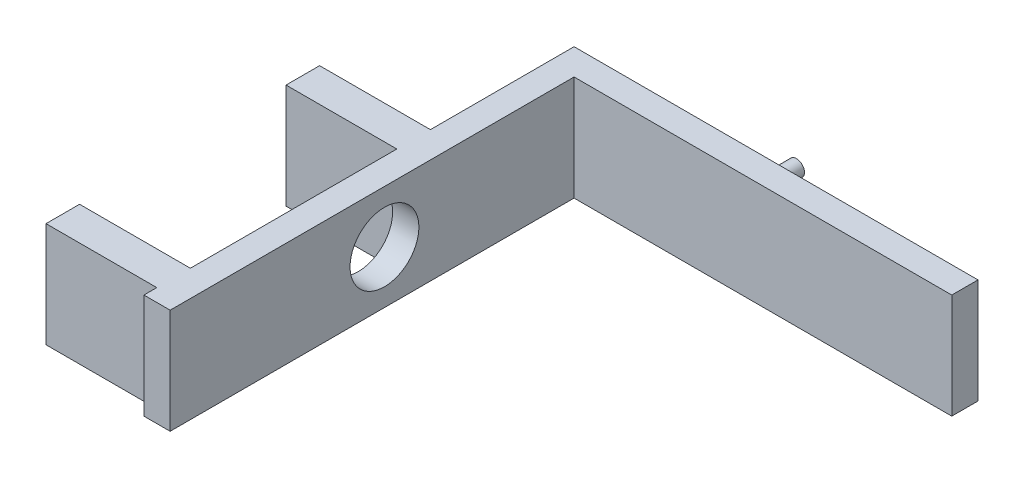
ISO-10303-21;
HEADER;
FILE_DESCRIPTION(('STEP AP214'),'2;1');
FILE_NAME('part.step','',(''),(''),'','','');
FILE_SCHEMA(('AUTOMOTIVE_DESIGN { 1 0 10303 214 1 1 1 1 }'));
ENDSEC;
DATA;
#1=APPLICATION_CONTEXT('core data for automotive mechanical design processes');
#2=APPLICATION_PROTOCOL_DEFINITION('international standard','automotive_design',2000,#1);
#3=PRODUCT_CONTEXT('',#1,'mechanical');
#4=PRODUCT('Part','Part','',(#3));
#5=PRODUCT_RELATED_PRODUCT_CATEGORY('part','',(#4));
#6=PRODUCT_DEFINITION_FORMATION('','',#4);
#7=PRODUCT_DEFINITION_CONTEXT('part definition',#1,'design');
#8=PRODUCT_DEFINITION('design','',#6,#7);
#9=PRODUCT_DEFINITION_SHAPE('','',#8);
#10=(LENGTH_UNIT() NAMED_UNIT(*) SI_UNIT(.MILLI.,.METRE.));
#11=(NAMED_UNIT(*) PLANE_ANGLE_UNIT() SI_UNIT($,.RADIAN.));
#12=(NAMED_UNIT(*) SI_UNIT($,.STERADIAN.) SOLID_ANGLE_UNIT());
#13=UNCERTAINTY_MEASURE_WITH_UNIT(LENGTH_MEASURE(1.E-05),#10,'distance_accuracy_value','');
#14=(GEOMETRIC_REPRESENTATION_CONTEXT(3) GLOBAL_UNCERTAINTY_ASSIGNED_CONTEXT((#13)) GLOBAL_UNIT_ASSIGNED_CONTEXT((#10,
#11,#12)) REPRESENTATION_CONTEXT('',''));
#15=CARTESIAN_POINT('',(0.,0.,0.));
#16=DIRECTION('',(0.,0.,1.));
#17=DIRECTION('',(1.,0.,0.));
#18=AXIS2_PLACEMENT_3D('',#15,#16,#17);
#19=CARTESIAN_POINT('',(-2.75770809575521,7.9375,19.8610872296146));
#20=DIRECTION('',(1.,0.,0.));
#21=DIRECTION('',(0.,0.,-1.));
#22=AXIS2_PLACEMENT_3D('',#19,#20,#21);
#23=PLANE('',#22);
#24=DIRECTION('',(0.,1.,0.));
#25=VECTOR('',#24,1.);
#26=CARTESIAN_POINT('',(-2.75770809575521,7.9375,17.9134401582819));
#27=LINE('',#26,#25);
#28=CARTESIAN_POINT('',(-2.75770809575521,-7.9375,17.9134401582819));
#29=VERTEX_POINT('',#28);
#30=CARTESIAN_POINT('',(-2.75770809575521,7.9375,17.9134401582819));
#31=VERTEX_POINT('',#30);
#32=EDGE_CURVE('E160',#29,#31,#27,.T.);
#33=ORIENTED_EDGE('',*,*,#32,.F.);
#34=DIRECTION('',(0.,0.,1.));
#35=VECTOR('',#34,1.);
#36=CARTESIAN_POINT('',(-2.75770809575521,-7.9375,19.8610872296146));
#37=LINE('',#36,#35);
#38=CARTESIAN_POINT('',(-2.75770809575521,-7.9375,19.8610872296146));
#39=VERTEX_POINT('',#38);
#40=EDGE_CURVE('E220',#29,#39,#37,.T.);
#41=ORIENTED_EDGE('',*,*,#40,.T.);
#42=DIRECTION('',(0.,-1.,0.));
#43=VECTOR('',#42,1.);
#44=CARTESIAN_POINT('',(-2.75770809575521,7.9375,19.8610872296146));
#45=LINE('',#44,#43);
#46=CARTESIAN_POINT('',(-2.75770809575521,7.9375,19.8610872296146));
#47=VERTEX_POINT('',#46);
#48=EDGE_CURVE('E243',#47,#39,#45,.T.);
#49=ORIENTED_EDGE('',*,*,#48,.F.);
#50=DIRECTION('',(0.,0.,1.));
#51=VECTOR('',#50,1.);
#52=CARTESIAN_POINT('',(-2.75770809575521,7.9375,19.8610872296146));
#53=LINE('',#52,#51);
#54=EDGE_CURVE('E52',#31,#47,#53,.T.);
#55=ORIENTED_EDGE('',*,*,#54,.F.);
#56=EDGE_LOOP('',(#33,#41,#49,#55));
#57=FACE_BOUND('',#56,.T.);
#58=ADVANCED_FACE('F37',(#57),#23,.F.);
#59=CARTESIAN_POINT('',(-2.75770809575521,0.,-12.5665598417181));
#60=DIRECTION('',(-1.,0.,0.));
#61=DIRECTION('',(0.,0.,1.));
#62=AXIS2_PLACEMENT_3D('',#59,#60,#61);
#63=CIRCLE('',#62,5.207);
#64=CARTESIAN_POINT('',(-2.75770809575521,0.,-7.35955984171809));
#65=VERTEX_POINT('',#64);
#66=EDGE_CURVE('E196',#65,#65,#63,.T.);
#67=ORIENTED_EDGE('',*,*,#66,.F.);
#68=EDGE_LOOP('',(#67));
#69=FACE_BOUND('',#68,.T.);
#70=DIRECTION('',(0.,-1.,0.));
#71=VECTOR('',#70,1.);
#72=CARTESIAN_POINT('',(-2.75770809575521,7.9375,12.8334401582819));
#73=LINE('',#72,#71);
#74=CARTESIAN_POINT('',(-2.75770809575521,7.9375,12.8334401582819));
#75=VERTEX_POINT('',#74);
#76=CARTESIAN_POINT('',(-2.75770809575521,-7.9375,12.8334401582819));
#77=VERTEX_POINT('',#76);
#78=EDGE_CURVE('E60',#75,#77,#73,.T.);
#79=ORIENTED_EDGE('',*,*,#78,.F.);
#80=CARTESIAN_POINT('',(-2.75770809575521,7.9375,-18.4085598417181));
#81=VERTEX_POINT('',#80);
#82=EDGE_CURVE('E210',#81,#75,#53,.T.);
#83=ORIENTED_EDGE('',*,*,#82,.F.);
#84=DIRECTION('',(0.,1.,0.));
#85=VECTOR('',#84,1.);
#86=CARTESIAN_POINT('',(-2.75770809575521,-7.9375,-18.4085598417181));
#87=LINE('',#86,#85);
#88=CARTESIAN_POINT('',(-2.75770809575521,-7.9375,-18.4085598417181));
#89=VERTEX_POINT('',#88);
#90=EDGE_CURVE('E161',#89,#81,#87,.T.);
#91=ORIENTED_EDGE('',*,*,#90,.F.);
#92=EDGE_CURVE('E224',#89,#77,#37,.T.);
#93=ORIENTED_EDGE('',*,*,#92,.T.);
#94=EDGE_LOOP('',(#79,#83,#91,#93));
#95=FACE_BOUND('',#94,.T.);
#96=ADVANCED_FACE('F321',(#69,#95),#23,.F.);
#97=DIRECTION('',(0.,-1.,0.));
#98=VECTOR('',#97,1.);
#99=CARTESIAN_POINT('',(-2.75770809575521,-7.9375,-23.4885598417181));
#100=LINE('',#99,#98);
#101=CARTESIAN_POINT('',(-2.75770809575521,7.9375,-23.4885598417181));
#102=VERTEX_POINT('',#101);
#103=CARTESIAN_POINT('',(-2.75770809575521,-7.9375,-23.4885598417181));
#104=VERTEX_POINT('',#103);
#105=EDGE_CURVE('E164',#102,#104,#100,.T.);
#106=ORIENTED_EDGE('',*,*,#105,.F.);
#107=CARTESIAN_POINT('',(-2.75770809575521,7.9375,-45.2264127703854));
#108=VERTEX_POINT('',#107);
#109=EDGE_CURVE('E206',#108,#102,#53,.T.);
#110=ORIENTED_EDGE('',*,*,#109,.F.);
#111=DIRECTION('',(0.,-1.,0.));
#112=VECTOR('',#111,1.);
#113=CARTESIAN_POINT('',(-2.75770809575521,7.9375,-45.2264127703854));
#114=LINE('',#113,#112);
#115=CARTESIAN_POINT('',(-2.75770809575521,-7.9375,-45.2264127703854));
#116=VERTEX_POINT('',#115);
#117=EDGE_CURVE('E45',#108,#116,#114,.T.);
#118=ORIENTED_EDGE('',*,*,#117,.T.);
#119=EDGE_CURVE('E221',#116,#104,#37,.T.);
#120=ORIENTED_EDGE('',*,*,#119,.T.);
#121=EDGE_LOOP('',(#106,#110,#118,#120));
#122=FACE_BOUND('',#121,.T.);
#123=ADVANCED_FACE('F250',(#122),#23,.F.);
#124=CARTESIAN_POINT('',(-2.75770809575521,7.9375,-45.2264127703854));
#125=DIRECTION('',(0.,0.,1.));
#126=DIRECTION('',(1.,0.,0.));
#127=AXIS2_PLACEMENT_3D('',#124,#125,#126);
#128=PLANE('',#127);
#129=CARTESIAN_POINT('',(22.0072919042448,0.,-45.2264127703854));
#130=DIRECTION('',(0.,0.,1.));
#131=DIRECTION('',(1.,0.,0.));
#132=AXIS2_PLACEMENT_3D('',#129,#130,#131);
#133=CIRCLE('',#132,1.2065);
#134=CARTESIAN_POINT('',(23.2137919042448,0.,-45.2264127703854));
#135=VERTEX_POINT('',#134);
#136=EDGE_CURVE('E11',#135,#135,#133,.F.);
#137=ORIENTED_EDGE('',*,*,#136,.F.);
#138=EDGE_LOOP('',(#137));
#139=FACE_BOUND('',#138,.T.);
#140=DIRECTION('',(-1.,0.,0.));
#141=VECTOR('',#140,1.);
#142=CARTESIAN_POINT('',(-2.75770809575521,-7.9375,-45.2264127703854));
#143=LINE('',#142,#141);
#144=CARTESIAN_POINT('',(58.3610419042448,-7.9375,-45.2264127703854));
#145=VERTEX_POINT('',#144);
#146=EDGE_CURVE('E202',#145,#116,#143,.T.);
#147=ORIENTED_EDGE('',*,*,#146,.T.);
#148=ORIENTED_EDGE('',*,*,#117,.F.);
#149=DIRECTION('',(-1.,0.,0.));
#150=VECTOR('',#149,1.);
#151=CARTESIAN_POINT('',(6.27967860958227,7.9375,-45.2264127703854));
#152=LINE('',#151,#150);
#153=CARTESIAN_POINT('',(58.3610419042448,7.9375,-45.2264127703854));
#154=VERTEX_POINT('',#153);
#155=EDGE_CURVE('E203',#154,#108,#152,.T.);
#156=ORIENTED_EDGE('',*,*,#155,.F.);
#157=DIRECTION('',(0.,-1.,0.));
#158=VECTOR('',#157,1.);
#159=CARTESIAN_POINT('',(58.3610419042448,7.9375,-45.2264127703854));
#160=LINE('',#159,#158);
#161=EDGE_CURVE('E218',#154,#145,#160,.T.);
#162=ORIENTED_EDGE('',*,*,#161,.T.);
#163=EDGE_LOOP('',(#147,#148,#156,#162));
#164=FACE_BOUND('',#163,.T.);
#165=ADVANCED_FACE('F39',(#139,#164),#128,.F.);
#166=CARTESIAN_POINT('',(-2.75770809575521,7.9375,19.8610872296146));
#167=DIRECTION('',(0.,0.,-1.));
#168=DIRECTION('',(-1.,0.,0.));
#169=AXIS2_PLACEMENT_3D('',#166,#167,#168);
#170=PLANE('',#169);
#171=DIRECTION('',(1.,0.,0.));
#172=VECTOR('',#171,1.);
#173=CARTESIAN_POINT('',(-2.75770809575521,-7.9375,19.8610872296146));
#174=LINE('',#173,#172);
#175=CARTESIAN_POINT('',(1.21104190424479,-7.9375,19.8610872296146));
#176=VERTEX_POINT('',#175);
#177=EDGE_CURVE('E223',#39,#176,#174,.T.);
#178=ORIENTED_EDGE('',*,*,#177,.T.);
#179=DIRECTION('',(0.,-1.,0.));
#180=VECTOR('',#179,1.);
#181=CARTESIAN_POINT('',(1.21104190424479,7.9375,19.8610872296146));
#182=LINE('',#181,#180);
#183=CARTESIAN_POINT('',(1.21104190424479,7.9375,19.8610872296146));
#184=VERTEX_POINT('',#183);
#185=EDGE_CURVE('E240',#184,#176,#182,.T.);
#186=ORIENTED_EDGE('',*,*,#185,.F.);
#187=DIRECTION('',(1.,0.,0.));
#188=VECTOR('',#187,1.);
#189=CARTESIAN_POINT('',(-2.75770809575521,7.9375,19.8610872296146));
#190=LINE('',#189,#188);
#191=EDGE_CURVE('E209',#47,#184,#190,.T.);
#192=ORIENTED_EDGE('',*,*,#191,.F.);
#193=ORIENTED_EDGE('',*,*,#48,.T.);
#194=EDGE_LOOP('',(#178,#186,#192,#193));
#195=FACE_BOUND('',#194,.T.);
#196=ADVANCED_FACE('F281',(#195),#170,.F.);
#197=CARTESIAN_POINT('',(1.21104190424479,7.9375,19.8610872296146));
#198=DIRECTION('',(-1.,0.,0.));
#199=DIRECTION('',(0.,0.,1.));
#200=AXIS2_PLACEMENT_3D('',#197,#198,#199);
#201=PLANE('',#200);
#202=CARTESIAN_POINT('',(1.21104190424479,0.,-12.5665598417181));
#203=DIRECTION('',(-1.,0.,0.));
#204=DIRECTION('',(0.,0.,1.));
#205=AXIS2_PLACEMENT_3D('',#202,#203,#204);
#206=CIRCLE('',#205,5.207);
#207=CARTESIAN_POINT('',(1.21104190424479,0.,-7.35955984171809));
#208=VERTEX_POINT('',#207);
#209=EDGE_CURVE('E199',#208,#208,#206,.F.);
#210=ORIENTED_EDGE('',*,*,#209,.F.);
#211=EDGE_LOOP('',(#210));
#212=FACE_BOUND('',#211,.T.);
#213=DIRECTION('',(0.,0.,-1.));
#214=VECTOR('',#213,1.);
#215=CARTESIAN_POINT('',(1.21104190424479,-7.9375,19.8610872296146));
#216=LINE('',#215,#214);
#217=CARTESIAN_POINT('',(1.21104190424479,-7.9375,-41.2576627703854));
#218=VERTEX_POINT('',#217);
#219=EDGE_CURVE('E226',#176,#218,#216,.T.);
#220=ORIENTED_EDGE('',*,*,#219,.T.);
#221=DIRECTION('',(0.,-1.,0.));
#222=VECTOR('',#221,1.);
#223=CARTESIAN_POINT('',(1.21104190424479,7.9375,-41.2576627703854));
#224=LINE('',#223,#222);
#225=CARTESIAN_POINT('',(1.21104190424479,7.9375,-41.2576627703854));
#226=VERTEX_POINT('',#225);
#227=EDGE_CURVE('E237',#226,#218,#224,.T.);
#228=ORIENTED_EDGE('',*,*,#227,.F.);
#229=DIRECTION('',(0.,0.,-1.));
#230=VECTOR('',#229,1.);
#231=CARTESIAN_POINT('',(1.21104190424479,7.9375,19.8610872296146));
#232=LINE('',#231,#230);
#233=EDGE_CURVE('E212',#184,#226,#232,.T.);
#234=ORIENTED_EDGE('',*,*,#233,.F.);
#235=ORIENTED_EDGE('',*,*,#185,.T.);
#236=EDGE_LOOP('',(#220,#228,#234,#235));
#237=FACE_BOUND('',#236,.T.);
#238=ADVANCED_FACE('F277',(#212,#237),#201,.F.);
#239=CARTESIAN_POINT('',(1.21104190424479,7.9375,-41.2576627703854));
#240=DIRECTION('',(0.,0.,-1.));
#241=DIRECTION('',(-1.,0.,0.));
#242=AXIS2_PLACEMENT_3D('',#239,#240,#241);
#243=PLANE('',#242);
#244=DIRECTION('',(1.,0.,0.));
#245=VECTOR('',#244,1.);
#246=CARTESIAN_POINT('',(1.21104190424479,-7.9375,-41.2576627703854));
#247=LINE('',#246,#245);
#248=CARTESIAN_POINT('',(58.3610419042448,-7.9375,-41.2576627703854));
#249=VERTEX_POINT('',#248);
#250=EDGE_CURVE('E228',#218,#249,#247,.T.);
#251=ORIENTED_EDGE('',*,*,#250,.T.);
#252=DIRECTION('',(0.,-1.,0.));
#253=VECTOR('',#252,1.);
#254=CARTESIAN_POINT('',(58.3610419042448,7.9375,-41.2576627703854));
#255=LINE('',#254,#253);
#256=CARTESIAN_POINT('',(58.3610419042448,7.9375,-41.2576627703854));
#257=VERTEX_POINT('',#256);
#258=EDGE_CURVE('E234',#257,#249,#255,.T.);
#259=ORIENTED_EDGE('',*,*,#258,.F.);
#260=DIRECTION('',(1.,0.,0.));
#261=VECTOR('',#260,1.);
#262=CARTESIAN_POINT('',(1.21104190424479,7.9375,-41.2576627703854));
#263=LINE('',#262,#261);
#264=EDGE_CURVE('E214',#226,#257,#263,.T.);
#265=ORIENTED_EDGE('',*,*,#264,.F.);
#266=ORIENTED_EDGE('',*,*,#227,.T.);
#267=EDGE_LOOP('',(#251,#259,#265,#266));
#268=FACE_BOUND('',#267,.T.);
#269=ADVANCED_FACE('F272',(#268),#243,.F.);
#270=CARTESIAN_POINT('',(58.3610419042448,7.9375,-45.2264127703854));
#271=DIRECTION('',(-1.,0.,0.));
#272=DIRECTION('',(0.,0.,1.));
#273=AXIS2_PLACEMENT_3D('',#270,#271,#272);
#274=PLANE('',#273);
#275=DIRECTION('',(0.,0.,-1.));
#276=VECTOR('',#275,1.);
#277=CARTESIAN_POINT('',(58.3610419042448,-7.9375,-45.2264127703854));
#278=LINE('',#277,#276);
#279=EDGE_CURVE('E205',#249,#145,#278,.T.);
#280=ORIENTED_EDGE('',*,*,#279,.T.);
#281=ORIENTED_EDGE('',*,*,#161,.F.);
#282=DIRECTION('',(0.,0.,-1.));
#283=VECTOR('',#282,1.);
#284=CARTESIAN_POINT('',(58.3610419042448,7.9375,-45.2264127703854));
#285=LINE('',#284,#283);
#286=EDGE_CURVE('E216',#257,#154,#285,.T.);
#287=ORIENTED_EDGE('',*,*,#286,.F.);
#288=ORIENTED_EDGE('',*,*,#258,.T.);
#289=EDGE_LOOP('',(#280,#281,#287,#288));
#290=FACE_BOUND('',#289,.T.);
#291=ADVANCED_FACE('F266',(#290),#274,.F.);
#292=CARTESIAN_POINT('',(0.,7.9375,0.));
#293=DIRECTION('',(0.,-1.,0.));
#294=DIRECTION('',(0.,0.,-1.));
#295=AXIS2_PLACEMENT_3D('',#292,#293,#294);
#296=PLANE('',#295);
#297=ORIENTED_EDGE('',*,*,#155,.T.);
#298=ORIENTED_EDGE('',*,*,#109,.T.);
#299=DIRECTION('',(1.,0.,0.));
#300=VECTOR('',#299,1.);
#301=CARTESIAN_POINT('',(-19.5217080957552,7.9375,-23.4885598417181));
#302=LINE('',#301,#300);
#303=CARTESIAN_POINT('',(-19.5217080957552,7.9375,-23.4885598417181));
#304=VERTEX_POINT('',#303);
#305=EDGE_CURVE('E187',#304,#102,#302,.T.);
#306=ORIENTED_EDGE('',*,*,#305,.F.);
#307=DIRECTION('',(0.,0.,-1.));
#308=VECTOR('',#307,1.);
#309=CARTESIAN_POINT('',(-19.5217080957552,7.9375,-23.4885598417181));
#310=LINE('',#309,#308);
#311=CARTESIAN_POINT('',(-19.5217080957552,7.9375,-18.4085598417181));
#312=VERTEX_POINT('',#311);
#313=EDGE_CURVE('E173',#312,#304,#310,.T.);
#314=ORIENTED_EDGE('',*,*,#313,.F.);
#315=DIRECTION('',(1.,0.,0.));
#316=VECTOR('',#315,1.);
#317=CARTESIAN_POINT('',(-19.5217080957552,7.9375,-18.4085598417181));
#318=LINE('',#317,#316);
#319=EDGE_CURVE('E190',#312,#81,#318,.T.);
#320=ORIENTED_EDGE('',*,*,#319,.T.);
#321=ORIENTED_EDGE('',*,*,#82,.T.);
#322=DIRECTION('',(1.,0.,0.));
#323=VECTOR('',#322,1.);
#324=CARTESIAN_POINT('',(-19.5217080957552,7.9375,12.8334401582819));
#325=LINE('',#324,#323);
#326=CARTESIAN_POINT('',(-19.5217080957552,7.9375,12.8334401582819));
#327=VERTEX_POINT('',#326);
#328=EDGE_CURVE('E145',#327,#75,#325,.T.);
#329=ORIENTED_EDGE('',*,*,#328,.F.);
#330=DIRECTION('',(0.,0.,-1.));
#331=VECTOR('',#330,1.);
#332=CARTESIAN_POINT('',(-19.5217080957552,7.9375,17.9134401582819));
#333=LINE('',#332,#331);
#334=CARTESIAN_POINT('',(-19.5217080957552,7.9375,17.9134401582819));
#335=VERTEX_POINT('',#334);
#336=EDGE_CURVE('E138',#335,#327,#333,.T.);
#337=ORIENTED_EDGE('',*,*,#336,.F.);
#338=DIRECTION('',(1.,0.,0.));
#339=VECTOR('',#338,1.);
#340=CARTESIAN_POINT('',(-19.5217080957552,7.9375,17.9134401582819));
#341=LINE('',#340,#339);
#342=EDGE_CURVE('E142',#335,#31,#341,.T.);
#343=ORIENTED_EDGE('',*,*,#342,.T.);
#344=ORIENTED_EDGE('',*,*,#54,.T.);
#345=ORIENTED_EDGE('',*,*,#191,.T.);
#346=ORIENTED_EDGE('',*,*,#233,.T.);
#347=ORIENTED_EDGE('',*,*,#264,.T.);
#348=ORIENTED_EDGE('',*,*,#286,.T.);
#349=EDGE_LOOP('',(#297,#298,#306,#314,#320,#321,#329,#337,#343,#344,#345,#346,#347,#348));
#350=FACE_BOUND('',#349,.T.);
#351=ADVANCED_FACE('F140',(#350),#296,.F.);
#352=CARTESIAN_POINT('',(0.,-7.9375,0.));
#353=DIRECTION('',(0.,-1.,0.));
#354=DIRECTION('',(0.,0.,-1.));
#355=AXIS2_PLACEMENT_3D('',#352,#353,#354);
#356=PLANE('',#355);
#357=ORIENTED_EDGE('',*,*,#146,.F.);
#358=ORIENTED_EDGE('',*,*,#279,.F.);
#359=ORIENTED_EDGE('',*,*,#250,.F.);
#360=ORIENTED_EDGE('',*,*,#219,.F.);
#361=ORIENTED_EDGE('',*,*,#177,.F.);
#362=ORIENTED_EDGE('',*,*,#40,.F.);
#363=DIRECTION('',(1.,0.,0.));
#364=VECTOR('',#363,1.);
#365=CARTESIAN_POINT('',(-19.5217080957552,-7.9375,17.9134401582819));
#366=LINE('',#365,#364);
#367=CARTESIAN_POINT('',(-19.5217080957552,-7.9375,17.9134401582819));
#368=VERTEX_POINT('',#367);
#369=EDGE_CURVE('E282',#368,#29,#366,.T.);
#370=ORIENTED_EDGE('',*,*,#369,.F.);
#371=DIRECTION('',(0.,0.,1.));
#372=VECTOR('',#371,1.);
#373=CARTESIAN_POINT('',(-19.5217080957552,-7.9375,17.9134401582819));
#374=LINE('',#373,#372);
#375=CARTESIAN_POINT('',(-19.5217080957552,-7.9375,12.8334401582819));
#376=VERTEX_POINT('',#375);
#377=EDGE_CURVE('E154',#376,#368,#374,.T.);
#378=ORIENTED_EDGE('',*,*,#377,.F.);
#379=DIRECTION('',(1.,0.,0.));
#380=VECTOR('',#379,1.);
#381=CARTESIAN_POINT('',(-19.5217080957552,-7.9375,12.8334401582819));
#382=LINE('',#381,#380);
#383=EDGE_CURVE('E166',#376,#77,#382,.T.);
#384=ORIENTED_EDGE('',*,*,#383,.T.);
#385=ORIENTED_EDGE('',*,*,#92,.F.);
#386=DIRECTION('',(1.,0.,0.));
#387=VECTOR('',#386,1.);
#388=CARTESIAN_POINT('',(-19.5217080957552,-7.9375,-18.4085598417181));
#389=LINE('',#388,#387);
#390=CARTESIAN_POINT('',(-19.5217080957552,-7.9375,-18.4085598417181));
#391=VERTEX_POINT('',#390);
#392=EDGE_CURVE('E178',#391,#89,#389,.T.);
#393=ORIENTED_EDGE('',*,*,#392,.F.);
#394=DIRECTION('',(0.,0.,1.));
#395=VECTOR('',#394,1.);
#396=CARTESIAN_POINT('',(-19.5217080957552,-7.9375,-23.4885598417181));
#397=LINE('',#396,#395);
#398=CARTESIAN_POINT('',(-19.5217080957552,-7.9375,-23.4885598417181));
#399=VERTEX_POINT('',#398);
#400=EDGE_CURVE('E177',#399,#391,#397,.T.);
#401=ORIENTED_EDGE('',*,*,#400,.F.);
#402=DIRECTION('',(1.,0.,0.));
#403=VECTOR('',#402,1.);
#404=CARTESIAN_POINT('',(-19.5217080957552,-7.9375,-23.4885598417181));
#405=LINE('',#404,#403);
#406=EDGE_CURVE('E184',#399,#104,#405,.T.);
#407=ORIENTED_EDGE('',*,*,#406,.T.);
#408=ORIENTED_EDGE('',*,*,#119,.F.);
#409=EDGE_LOOP('',(#357,#358,#359,#360,#361,#362,#370,#378,#384,#385,#393,#401,#407,#408));
#410=FACE_BOUND('',#409,.T.);
#411=ADVANCED_FACE('F254',(#410),#356,.T.);
#412=CARTESIAN_POINT('',(15.9386619427982,0.,-12.5665598417181));
#413=DIRECTION('',(-1.,0.,0.));
#414=DIRECTION('',(0.,0.,1.));
#415=AXIS2_PLACEMENT_3D('',#412,#413,#414);
#416=CYLINDRICAL_SURFACE('',#415,5.207);
#417=ORIENTED_EDGE('',*,*,#209,.T.);
#418=EDGE_LOOP('',(#417));
#419=FACE_BOUND('',#418,.T.);
#420=ORIENTED_EDGE('',*,*,#66,.T.);
#421=EDGE_LOOP('',(#420));
#422=FACE_BOUND('',#421,.T.);
#423=ADVANCED_FACE('F340',(#419,#422),#416,.F.);
#424=CARTESIAN_POINT('',(22.0072919042448,0.,-54.1164127703854));
#425=DIRECTION('',(0.,0.,1.));
#426=DIRECTION('',(1.,0.,0.));
#427=AXIS2_PLACEMENT_3D('',#424,#425,#426);
#428=CYLINDRICAL_SURFACE('',#427,1.2065);
#429=CARTESIAN_POINT('',(22.0072919042448,0.,-54.1164127703854));
#430=DIRECTION('',(0.,0.,-1.));
#431=DIRECTION('',(-1.,0.,0.));
#432=AXIS2_PLACEMENT_3D('',#429,#430,#431);
#433=CIRCLE('',#432,1.2065);
#434=CARTESIAN_POINT('',(20.8007919042448,0.,-54.1164127703854));
#435=VERTEX_POINT('',#434);
#436=EDGE_CURVE('E193',#435,#435,#433,.T.);
#437=ORIENTED_EDGE('',*,*,#436,.F.);
#438=EDGE_LOOP('',(#437));
#439=FACE_BOUND('',#438,.T.);
#440=ORIENTED_EDGE('',*,*,#136,.T.);
#441=EDGE_LOOP('',(#440));
#442=FACE_BOUND('',#441,.T.);
#443=ADVANCED_FACE('F337',(#439,#442),#428,.T.);
#444=CARTESIAN_POINT('',(22.0072919042448,0.,-54.1164127703854));
#445=DIRECTION('',(0.,0.,-1.));
#446=DIRECTION('',(-1.,0.,0.));
#447=AXIS2_PLACEMENT_3D('',#444,#445,#446);
#448=PLANE('',#447);
#449=ORIENTED_EDGE('',*,*,#436,.T.);
#450=EDGE_LOOP('',(#449));
#451=FACE_BOUND('',#450,.T.);
#452=ADVANCED_FACE('F339',(#451),#448,.T.);
#453=CARTESIAN_POINT('',(-19.5217080957552,-7.9375,-18.4085598417181));
#454=DIRECTION('',(0.,0.,-1.));
#455=DIRECTION('',(-1.,0.,0.));
#456=AXIS2_PLACEMENT_3D('',#453,#454,#455);
#457=PLANE('',#456);
#458=ORIENTED_EDGE('',*,*,#90,.T.);
#459=ORIENTED_EDGE('',*,*,#319,.F.);
#460=DIRECTION('',(0.,1.,0.));
#461=VECTOR('',#460,1.);
#462=CARTESIAN_POINT('',(-19.5217080957552,-7.9375,-18.4085598417181));
#463=LINE('',#462,#461);
#464=EDGE_CURVE('E170',#391,#312,#463,.T.);
#465=ORIENTED_EDGE('',*,*,#464,.F.);
#466=ORIENTED_EDGE('',*,*,#392,.T.);
#467=EDGE_LOOP('',(#458,#459,#465,#466));
#468=FACE_BOUND('',#467,.T.);
#469=ADVANCED_FACE('F347',(#468),#457,.F.);
#470=CARTESIAN_POINT('',(-19.5217080957552,-7.9375,-23.4885598417181));
#471=DIRECTION('',(0.,0.,1.));
#472=DIRECTION('',(1.,0.,0.));
#473=AXIS2_PLACEMENT_3D('',#470,#471,#472);
#474=PLANE('',#473);
#475=ORIENTED_EDGE('',*,*,#105,.T.);
#476=ORIENTED_EDGE('',*,*,#406,.F.);
#477=DIRECTION('',(0.,-1.,0.));
#478=VECTOR('',#477,1.);
#479=CARTESIAN_POINT('',(-19.5217080957552,-7.9375,-23.4885598417181));
#480=LINE('',#479,#478);
#481=EDGE_CURVE('E175',#304,#399,#480,.T.);
#482=ORIENTED_EDGE('',*,*,#481,.F.);
#483=ORIENTED_EDGE('',*,*,#305,.T.);
#484=EDGE_LOOP('',(#475,#476,#482,#483));
#485=FACE_BOUND('',#484,.T.);
#486=ADVANCED_FACE('F261',(#485),#474,.F.);
#487=CARTESIAN_POINT('',(-19.5217080957552,0.,0.));
#488=DIRECTION('',(1.,0.,0.));
#489=DIRECTION('',(0.,0.,-1.));
#490=AXIS2_PLACEMENT_3D('',#487,#488,#489);
#491=PLANE('',#490);
#492=CARTESIAN_POINT('',(-19.5217080957552,3.43193186020793E-13,-21.0345598417068));
#493=DIRECTION('',(-1.,0.,0.));
#494=DIRECTION('',(0.,0.,1.));
#495=AXIS2_PLACEMENT_3D('',#492,#493,#494);
#496=CIRCLE('',#495,1.14299999998912);
#497=CARTESIAN_POINT('',(-19.5217080957552,3.43193186020793E-13,-19.8915598417177));
#498=VERTEX_POINT('',#497);
#499=EDGE_CURVE('E291',#498,#498,#496,.T.);
#500=ORIENTED_EDGE('',*,*,#499,.F.);
#501=EDGE_LOOP('',(#500));
#502=FACE_BOUND('',#501,.T.);
#503=ORIENTED_EDGE('',*,*,#464,.T.);
#504=ORIENTED_EDGE('',*,*,#313,.T.);
#505=ORIENTED_EDGE('',*,*,#481,.T.);
#506=ORIENTED_EDGE('',*,*,#400,.T.);
#507=EDGE_LOOP('',(#503,#504,#505,#506));
#508=FACE_BOUND('',#507,.T.);
#509=ADVANCED_FACE('F455',(#502,#508),#491,.F.);
#510=CARTESIAN_POINT('',(-19.5217080957552,7.9375,17.9134401582819));
#511=DIRECTION('',(0.,0.,-1.));
#512=DIRECTION('',(0.,1.,0.));
#513=AXIS2_PLACEMENT_3D('',#510,#511,#512);
#514=PLANE('',#513);
#515=ORIENTED_EDGE('',*,*,#32,.T.);
#516=ORIENTED_EDGE('',*,*,#342,.F.);
#517=DIRECTION('',(0.,1.,0.));
#518=VECTOR('',#517,1.);
#519=CARTESIAN_POINT('',(-19.5217080957552,7.9375,17.9134401582819));
#520=LINE('',#519,#518);
#521=EDGE_CURVE('E149',#368,#335,#520,.T.);
#522=ORIENTED_EDGE('',*,*,#521,.F.);
#523=ORIENTED_EDGE('',*,*,#369,.T.);
#524=EDGE_LOOP('',(#515,#516,#522,#523));
#525=FACE_BOUND('',#524,.T.);
#526=ADVANCED_FACE('F159',(#525),#514,.F.);
#527=CARTESIAN_POINT('',(-19.5217080957552,7.9375,12.8334401582819));
#528=DIRECTION('',(0.,0.,1.));
#529=DIRECTION('',(0.,-1.,0.));
#530=AXIS2_PLACEMENT_3D('',#527,#528,#529);
#531=PLANE('',#530);
#532=ORIENTED_EDGE('',*,*,#78,.T.);
#533=ORIENTED_EDGE('',*,*,#383,.F.);
#534=DIRECTION('',(0.,-1.,0.));
#535=VECTOR('',#534,1.);
#536=CARTESIAN_POINT('',(-19.5217080957552,7.9375,12.8334401582819));
#537=LINE('',#536,#535);
#538=EDGE_CURVE('E148',#327,#376,#537,.T.);
#539=ORIENTED_EDGE('',*,*,#538,.F.);
#540=ORIENTED_EDGE('',*,*,#328,.T.);
#541=EDGE_LOOP('',(#532,#533,#539,#540));
#542=FACE_BOUND('',#541,.T.);
#543=ADVANCED_FACE('F312',(#542),#531,.F.);
#544=CARTESIAN_POINT('',(-19.5217080957552,0.,0.));
#545=DIRECTION('',(1.,0.,0.));
#546=DIRECTION('',(0.,0.,-1.));
#547=AXIS2_PLACEMENT_3D('',#544,#545,#546);
#548=PLANE('',#547);
#549=CARTESIAN_POINT('',(-19.5217080957552,3.38797904165717E-13,14.8556401582932));
#550=DIRECTION('',(-1.,0.,0.));
#551=DIRECTION('',(0.,0.,1.));
#552=AXIS2_PLACEMENT_3D('',#549,#550,#551);
#553=CIRCLE('',#552,1.14299999998912);
#554=CARTESIAN_POINT('',(-19.5217080957552,3.38797904165717E-13,15.9986401582823));
#555=VERTEX_POINT('',#554);
#556=EDGE_CURVE('E297',#555,#555,#553,.T.);
#557=ORIENTED_EDGE('',*,*,#556,.F.);
#558=EDGE_LOOP('',(#557));
#559=FACE_BOUND('',#558,.T.);
#560=ORIENTED_EDGE('',*,*,#521,.T.);
#561=ORIENTED_EDGE('',*,*,#336,.T.);
#562=ORIENTED_EDGE('',*,*,#538,.T.);
#563=ORIENTED_EDGE('',*,*,#377,.T.);
#564=EDGE_LOOP('',(#560,#561,#562,#563));
#565=FACE_BOUND('',#564,.T.);
#566=ADVANCED_FACE('F152',(#559,#565),#548,.F.);
#567=CARTESIAN_POINT('',(-6.82170809575521,3.38797904165717E-13,14.8556401582932));
#568=DIRECTION('',(-1.,0.,0.));
#569=DIRECTION('',(0.,0.,1.));
#570=AXIS2_PLACEMENT_3D('',#567,#568,#569);
#571=CYLINDRICAL_SURFACE('',#570,1.14299999998912);
#572=CARTESIAN_POINT('',(-6.82170809575521,3.38797904165717E-13,14.8556401582932));
#573=DIRECTION('',(-1.,0.,0.));
#574=DIRECTION('',(0.,0.,1.));
#575=AXIS2_PLACEMENT_3D('',#572,#573,#574);
#576=CIRCLE('',#575,1.14299999998912);
#577=CARTESIAN_POINT('',(-6.82170809575521,3.38797904165717E-13,15.9986401582823));
#578=VERTEX_POINT('',#577);
#579=EDGE_CURVE('E283',#578,#578,#576,.T.);
#580=ORIENTED_EDGE('',*,*,#579,.F.);
#581=EDGE_LOOP('',(#580));
#582=FACE_BOUND('',#581,.T.);
#583=ORIENTED_EDGE('',*,*,#556,.T.);
#584=EDGE_LOOP('',(#583));
#585=FACE_BOUND('',#584,.T.);
#586=ADVANCED_FACE('F305',(#582,#585),#571,.F.);
#587=CARTESIAN_POINT('',(-6.82170809575521,3.38797904165717E-13,14.8556401582932));
#588=DIRECTION('',(-1.,0.,0.));
#589=DIRECTION('',(0.,0.,1.));
#590=AXIS2_PLACEMENT_3D('',#587,#588,#589);
#591=PLANE('',#590);
#592=ORIENTED_EDGE('',*,*,#579,.T.);
#593=EDGE_LOOP('',(#592));
#594=FACE_BOUND('',#593,.T.);
#595=ADVANCED_FACE('F303',(#594),#591,.T.);
#596=CARTESIAN_POINT('',(-6.82170809575521,3.43193186020793E-13,-21.0345598417068));
#597=DIRECTION('',(-1.,0.,0.));
#598=DIRECTION('',(0.,0.,1.));
#599=AXIS2_PLACEMENT_3D('',#596,#597,#598);
#600=CYLINDRICAL_SURFACE('',#599,1.14299999998912);
#601=CARTESIAN_POINT('',(-6.82170809575521,3.43193186020793E-13,-21.0345598417068));
#602=DIRECTION('',(-1.,0.,0.));
#603=DIRECTION('',(0.,0.,1.));
#604=AXIS2_PLACEMENT_3D('',#601,#602,#603);
#605=CIRCLE('',#604,1.14299999998912);
#606=CARTESIAN_POINT('',(-6.82170809575521,3.43193186020793E-13,-19.8915598417177));
#607=VERTEX_POINT('',#606);
#608=EDGE_CURVE('E294',#607,#607,#605,.T.);
#609=ORIENTED_EDGE('',*,*,#608,.F.);
#610=EDGE_LOOP('',(#609));
#611=FACE_BOUND('',#610,.T.);
#612=ORIENTED_EDGE('',*,*,#499,.T.);
#613=EDGE_LOOP('',(#612));
#614=FACE_BOUND('',#613,.T.);
#615=ADVANCED_FACE('F492',(#611,#614),#600,.F.);
#616=CARTESIAN_POINT('',(-6.82170809575521,3.43193186020793E-13,-21.0345598417068));
#617=DIRECTION('',(-1.,0.,0.));
#618=DIRECTION('',(0.,0.,1.));
#619=AXIS2_PLACEMENT_3D('',#616,#617,#618);
#620=PLANE('',#619);
#621=ORIENTED_EDGE('',*,*,#608,.T.);
#622=EDGE_LOOP('',(#621));
#623=FACE_BOUND('',#622,.T.);
#624=ADVANCED_FACE('F500',(#623),#620,.T.);
#625=CLOSED_SHELL('',(#58,#96,#123,#165,#196,#238,#269,#291,#351,#411,#423,#443,#452,#469,#486,
#509,#526,#543,#566,#586,#595,#615,#624));
#626=MANIFOLD_SOLID_BREP('B2',#625);
#627=ADVANCED_BREP_SHAPE_REPRESENTATION('',(#18,#626),#14);
#628=SHAPE_DEFINITION_REPRESENTATION(#9,#627);
ENDSEC;
END-ISO-10303-21;
